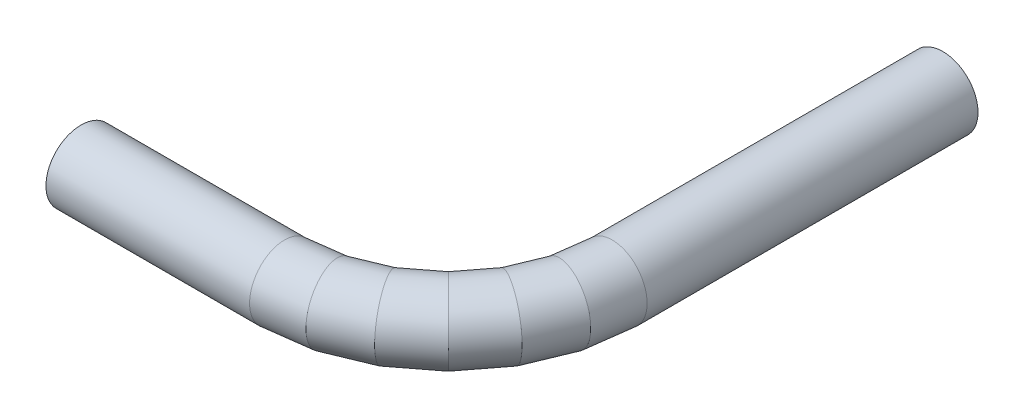
ISO-10303-21;
HEADER;
FILE_DESCRIPTION(('STEP AP214'),'2;1');
FILE_NAME('part.step','',(''),(''),'','','');
FILE_SCHEMA(('AUTOMOTIVE_DESIGN { 1 0 10303 214 1 1 1 1 }'));
ENDSEC;
DATA;
#1=APPLICATION_CONTEXT('core data for automotive mechanical design processes');
#2=APPLICATION_PROTOCOL_DEFINITION('international standard','automotive_design',2000,#1);
#3=PRODUCT_CONTEXT('',#1,'mechanical');
#4=PRODUCT('Part','Part','',(#3));
#5=PRODUCT_RELATED_PRODUCT_CATEGORY('part','',(#4));
#6=PRODUCT_DEFINITION_FORMATION('','',#4);
#7=PRODUCT_DEFINITION_CONTEXT('part definition',#1,'design');
#8=PRODUCT_DEFINITION('design','',#6,#7);
#9=PRODUCT_DEFINITION_SHAPE('','',#8);
#10=(LENGTH_UNIT() NAMED_UNIT(*) SI_UNIT(.MILLI.,.METRE.));
#11=(NAMED_UNIT(*) PLANE_ANGLE_UNIT() SI_UNIT($,.RADIAN.));
#12=(NAMED_UNIT(*) SI_UNIT($,.STERADIAN.) SOLID_ANGLE_UNIT());
#13=UNCERTAINTY_MEASURE_WITH_UNIT(LENGTH_MEASURE(1.E-05),#10,'distance_accuracy_value','');
#14=(GEOMETRIC_REPRESENTATION_CONTEXT(3) GLOBAL_UNCERTAINTY_ASSIGNED_CONTEXT((#13)) GLOBAL_UNIT_ASSIGNED_CONTEXT((#10,
#11,#12)) REPRESENTATION_CONTEXT('',''));
#15=CARTESIAN_POINT('',(0.,0.,0.));
#16=DIRECTION('',(0.,0.,1.));
#17=DIRECTION('',(1.,0.,0.));
#18=AXIS2_PLACEMENT_3D('',#15,#16,#17);
#19=CARTESIAN_POINT('',(-2911.59277838077,0.,55.3289105438819));
#20=DIRECTION('',(0.,0.,-1.));
#21=DIRECTION('',(0.,1.,0.));
#22=AXIS2_PLACEMENT_3D('',#19,#20,#21);
#23=CYLINDRICAL_SURFACE('',#22,3.175);
#24=CARTESIAN_POINT('',(-2911.59277838077,0.,55.0000000000001));
#25=DIRECTION('',(0.065403129230125,0.,-0.997858923238605));
#26=DIRECTION('',(0.997858923238605,0.,0.065403129230125));
#27=AXIS2_PLACEMENT_3D('',#24,#25,#26);
#28=ELLIPSE('',#27,3.18181250481317,3.175);
#29=CARTESIAN_POINT('',(-2908.41777838077,0.,55.2081004944384));
#30=VERTEX_POINT('',#29);
#31=EDGE_CURVE('E45',#30,#30,#28,.F.);
#32=ORIENTED_EDGE('',*,*,#31,.F.);
#33=EDGE_LOOP('',(#32));
#34=FACE_BOUND('',#33,.T.);
#35=CARTESIAN_POINT('',(-2911.59277838077,0.,25.2999999999997));
#36=DIRECTION('',(0.,0.,-1.));
#37=DIRECTION('',(-1.,0.,0.));
#38=AXIS2_PLACEMENT_3D('',#35,#36,#37);
#39=CIRCLE('',#38,3.175);
#40=CARTESIAN_POINT('',(-2914.76777838077,0.,25.2999999999997));
#41=VERTEX_POINT('',#40);
#42=EDGE_CURVE('E80',#41,#41,#39,.T.);
#43=ORIENTED_EDGE('',*,*,#42,.F.);
#44=EDGE_LOOP('',(#43));
#45=FACE_BOUND('',#44,.T.);
#46=ADVANCED_FACE('F39',(#34,#45),#23,.T.);
#47=CARTESIAN_POINT('',(-2912.17695907214,0.,59.4372928890041));
#48=DIRECTION('',(0.130526192220016,0.,-0.991444861373815));
#49=DIRECTION('',(-0.991444861373815,0.,-0.130526192220016));
#50=AXIS2_PLACEMENT_3D('',#47,#48,#49);
#51=CYLINDRICAL_SURFACE('',#50,3.175);
#52=CARTESIAN_POINT('',(-2912.10389098644,0.,58.8822856765378));
#53=DIRECTION('',(0.258819045102501,0.,-0.965925826289073));
#54=DIRECTION('',(0.965925826289074,0.,0.258819045102501));
#55=AXIS2_PLACEMENT_3D('',#52,#53,#54);
#56=ELLIPSE('',#55,3.20239694984199,3.175);
#57=CARTESIAN_POINT('',(-2909.01061306656,0.,59.7111269971351));
#58=VERTEX_POINT('',#57);
#59=EDGE_CURVE('E94',#58,#58,#56,.F.);
#60=ORIENTED_EDGE('',*,*,#59,.F.);
#61=EDGE_LOOP('',(#60));
#62=FACE_BOUND('',#61,.T.);
#63=ORIENTED_EDGE('',*,*,#31,.T.);
#64=EDGE_LOOP('',(#63));
#65=FACE_BOUND('',#64,.T.);
#66=ADVANCED_FACE('F101',(#62,#65),#51,.T.);
#67=CARTESIAN_POINT('',(-2913.81662211182,0.,63.0171843881291));
#68=DIRECTION('',(0.382683432365086,0.,-0.923879532511288));
#69=DIRECTION('',(-0.923879532511288,0.,-0.382683432365086));
#70=AXIS2_PLACEMENT_3D('',#67,#68,#69);
#71=CYLINDRICAL_SURFACE('',#70,3.175);
#72=CARTESIAN_POINT('',(-2913.60239732401,0.,62.4999999999998));
#73=DIRECTION('',(0.50000000000001,0.,-0.866025403784433));
#74=DIRECTION('',(0.866025403784433,0.,0.50000000000001));
#75=AXIS2_PLACEMENT_3D('',#72,#73,#74);
#76=ELLIPSE('',#75,3.20239694984199,3.175);
#77=CARTESIAN_POINT('',(-2910.82904021244,0.,64.1011984749208));
#78=VERTEX_POINT('',#77);
#79=EDGE_CURVE('E95',#78,#78,#76,.F.);
#80=ORIENTED_EDGE('',*,*,#79,.F.);
#81=EDGE_LOOP('',(#80));
#82=FACE_BOUND('',#81,.T.);
#83=ORIENTED_EDGE('',*,*,#59,.T.);
#84=EDGE_LOOP('',(#83));
#85=FACE_BOUND('',#84,.T.);
#86=ADVANCED_FACE('F251',(#82,#85),#71,.T.);
#87=CARTESIAN_POINT('',(-2916.32695908763,0.,66.0507180202266));
#88=DIRECTION('',(0.608761429008742,0.,-0.793353340291219));
#89=DIRECTION('',(-0.793353340291219,0.,-0.608761429008742));
#90=AXIS2_PLACEMENT_3D('',#87,#88,#89);
#91=CYLINDRICAL_SURFACE('',#90,3.175);
#92=CARTESIAN_POINT('',(-2915.98617666298,0.,65.6066017177984));
#93=DIRECTION('',(0.70710678118655,0.,-0.707106781186545));
#94=DIRECTION('',(0.707106781186545,0.,0.70710678118655));
#95=AXIS2_PLACEMENT_3D('',#92,#93,#94);
#96=ELLIPSE('',#95,3.20239694984197,3.175);
#97=CARTESIAN_POINT('',(-2913.72174006369,0.,67.8710383170828));
#98=VERTEX_POINT('',#97);
#99=EDGE_CURVE('E90',#98,#98,#96,.F.);
#100=ORIENTED_EDGE('',*,*,#99,.F.);
#101=EDGE_LOOP('',(#100));
#102=FACE_BOUND('',#101,.T.);
#103=ORIENTED_EDGE('',*,*,#79,.T.);
#104=EDGE_LOOP('',(#103));
#105=FACE_BOUND('',#104,.T.);
#106=ADVANCED_FACE('F241',(#102,#105),#91,.T.);
#107=CARTESIAN_POINT('',(-2919.5368946832,0.,68.3311634814221));
#108=DIRECTION('',(0.793353340291223,0.,-0.608761429008737));
#109=DIRECTION('',(-0.608761429008737,0.,-0.793353340291223));
#110=AXIS2_PLACEMENT_3D('',#107,#108,#109);
#111=CYLINDRICAL_SURFACE('',#110,3.175);
#112=CARTESIAN_POINT('',(-2919.09277838077,0.,67.9903810567668));
#113=DIRECTION('',(0.866025403784438,0.,-0.500000000000001));
#114=DIRECTION('',(0.500000000000001,0.,0.866025403784438));
#115=AXIS2_PLACEMENT_3D('',#112,#113,#114);
#116=ELLIPSE('',#115,3.20239694984199,3.175);
#117=CARTESIAN_POINT('',(-2917.49157990585,0.,70.7637381683317));
#118=VERTEX_POINT('',#117);
#119=EDGE_CURVE('E88',#118,#118,#116,.F.);
#120=ORIENTED_EDGE('',*,*,#119,.F.);
#121=EDGE_LOOP('',(#120));
#122=FACE_BOUND('',#121,.T.);
#123=ORIENTED_EDGE('',*,*,#99,.T.);
#124=EDGE_LOOP('',(#123));
#125=FACE_BOUND('',#124,.T.);
#126=ADVANCED_FACE('F233',(#122,#125),#111,.T.);
#127=CARTESIAN_POINT('',(-2923.22767709237,0.,69.703112182147));
#128=DIRECTION('',(0.923879532511294,0.,-0.382683432365073));
#129=DIRECTION('',(-0.382683432365073,0.,-0.923879532511294));
#130=AXIS2_PLACEMENT_3D('',#127,#128,#129);
#131=CYLINDRICAL_SURFACE('',#130,3.175);
#132=CARTESIAN_POINT('',(-2922.71049270424,0.,69.4888873943361));
#133=DIRECTION('',(0.965925826289071,0.,-0.258819045102512));
#134=DIRECTION('',(0.258819045102512,0.,0.965925826289071));
#135=AXIS2_PLACEMENT_3D('',#132,#133,#134);
#136=ELLIPSE('',#135,3.20239694984198,3.175);
#137=CARTESIAN_POINT('',(-2921.88165138364,0.,72.5821653142178));
#138=VERTEX_POINT('',#137);
#139=EDGE_CURVE('E85',#138,#138,#136,.F.);
#140=ORIENTED_EDGE('',*,*,#139,.F.);
#141=EDGE_LOOP('',(#140));
#142=FACE_BOUND('',#141,.T.);
#143=ORIENTED_EDGE('',*,*,#119,.T.);
#144=EDGE_LOOP('',(#143));
#145=FACE_BOUND('',#144,.T.);
#146=ADVANCED_FACE('F227',(#142,#145),#131,.T.);
#147=CARTESIAN_POINT('',(-2926.91887504936,0.,70.042931440874));
#148=DIRECTION('',(0.99144486137381,0.,-0.13052619222005));
#149=DIRECTION('',(-0.13052619222005,0.,-0.991444861373811));
#150=AXIS2_PLACEMENT_3D('',#147,#148,#149);
#151=CYLINDRICAL_SURFACE('',#150,3.175);
#152=CARTESIAN_POINT('',(-2926.59277838077,0.,70.));
#153=DIRECTION('',(0.997858923238604,0.,-0.0654031292301424));
#154=DIRECTION('',(0.0654031292301424,0.,0.997858923238604));
#155=AXIS2_PLACEMENT_3D('',#152,#153,#154);
#156=ELLIPSE('',#155,3.18181250481317,3.175);
#157=CARTESIAN_POINT('',(-2926.38467788634,0.,73.175));
#158=VERTEX_POINT('',#157);
#159=EDGE_CURVE('E78',#158,#158,#156,.F.);
#160=ORIENTED_EDGE('',*,*,#159,.F.);
#161=EDGE_LOOP('',(#160));
#162=FACE_BOUND('',#161,.T.);
#163=ORIENTED_EDGE('',*,*,#139,.T.);
#164=EDGE_LOOP('',(#163));
#165=FACE_BOUND('',#164,.T.);
#166=ADVANCED_FACE('F118',(#162,#165),#151,.T.);
#167=CARTESIAN_POINT('',(-2944.79277838077,0.,70.));
#168=DIRECTION('',(1.,0.,0.));
#169=DIRECTION('',(0.,0.,-1.));
#170=AXIS2_PLACEMENT_3D('',#167,#168,#169);
#171=CYLINDRICAL_SURFACE('',#170,3.175);
#172=CARTESIAN_POINT('',(-2944.79277838077,0.,70.));
#173=DIRECTION('',(1.,0.,0.));
#174=DIRECTION('',(0.,0.,-1.));
#175=AXIS2_PLACEMENT_3D('',#172,#173,#174);
#176=CIRCLE('',#175,3.175);
#177=CARTESIAN_POINT('',(-2944.79277838077,0.,66.825));
#178=VERTEX_POINT('',#177);
#179=EDGE_CURVE('E74',#178,#178,#176,.T.);
#180=ORIENTED_EDGE('',*,*,#179,.T.);
#181=EDGE_LOOP('',(#180));
#182=FACE_BOUND('',#181,.T.);
#183=ORIENTED_EDGE('',*,*,#159,.T.);
#184=EDGE_LOOP('',(#183));
#185=FACE_BOUND('',#184,.T.);
#186=ADVANCED_FACE('F109',(#182,#185),#171,.T.);
#187=CARTESIAN_POINT('',(-2911.59277838077,0.,25.2999999999997));
#188=DIRECTION('',(0.,0.,-1.));
#189=DIRECTION('',(-1.,0.,0.));
#190=AXIS2_PLACEMENT_3D('',#187,#188,#189);
#191=PLANE('',#190);
#192=CARTESIAN_POINT('',(-2911.59277838077,0.,25.2999999999997));
#193=DIRECTION('',(0.,0.,-1.));
#194=DIRECTION('',(-1.,0.,0.));
#195=AXIS2_PLACEMENT_3D('',#192,#193,#194);
#196=CIRCLE('',#195,2.286);
#197=CARTESIAN_POINT('',(-2913.87877838077,0.,25.2999999999997));
#198=VERTEX_POINT('',#197);
#199=EDGE_CURVE('E72',#198,#198,#196,.F.);
#200=ORIENTED_EDGE('',*,*,#199,.T.);
#201=EDGE_LOOP('',(#200));
#202=FACE_BOUND('',#201,.T.);
#203=ORIENTED_EDGE('',*,*,#42,.T.);
#204=EDGE_LOOP('',(#203));
#205=FACE_BOUND('',#204,.T.);
#206=ADVANCED_FACE('F110',(#202,#205),#191,.T.);
#207=CARTESIAN_POINT('',(-2944.79277838077,0.,70.));
#208=DIRECTION('',(1.,0.,0.));
#209=DIRECTION('',(0.,0.,-1.));
#210=AXIS2_PLACEMENT_3D('',#207,#208,#209);
#211=PLANE('',#210);
#212=CARTESIAN_POINT('',(-2944.79277838077,0.,70.));
#213=DIRECTION('',(1.,0.,0.));
#214=DIRECTION('',(0.,0.,-1.));
#215=AXIS2_PLACEMENT_3D('',#212,#213,#214);
#216=CIRCLE('',#215,2.286);
#217=CARTESIAN_POINT('',(-2944.79277838077,0.,67.714));
#218=VERTEX_POINT('',#217);
#219=EDGE_CURVE('E46',#218,#218,#216,.F.);
#220=ORIENTED_EDGE('',*,*,#219,.F.);
#221=EDGE_LOOP('',(#220));
#222=FACE_BOUND('',#221,.T.);
#223=ORIENTED_EDGE('',*,*,#179,.F.);
#224=EDGE_LOOP('',(#223));
#225=FACE_BOUND('',#224,.T.);
#226=ADVANCED_FACE('F108',(#222,#225),#211,.F.);
#227=CARTESIAN_POINT('',(-2911.59277838077,0.,55.2648155915949));
#228=DIRECTION('',(0.,0.,-1.));
#229=DIRECTION('',(0.,1.,0.));
#230=AXIS2_PLACEMENT_3D('',#227,#228,#229);
#231=CYLINDRICAL_SURFACE('',#230,2.286);
#232=CARTESIAN_POINT('',(-2911.59277838077,0.,55.));
#233=DIRECTION('',(0.065403129230125,0.,-0.997858923238605));
#234=DIRECTION('',(0.997858923238605,0.,0.065403129230125));
#235=AXIS2_PLACEMENT_3D('',#232,#233,#234);
#236=ELLIPSE('',#235,2.29090500346548,2.286);
#237=CARTESIAN_POINT('',(-2909.30677838077,0.,55.1498323559956));
#238=VERTEX_POINT('',#237);
#239=EDGE_CURVE('E70',#238,#238,#236,.T.);
#240=ORIENTED_EDGE('',*,*,#239,.F.);
#241=EDGE_LOOP('',(#240));
#242=FACE_BOUND('',#241,.T.);
#243=ORIENTED_EDGE('',*,*,#199,.F.);
#244=EDGE_LOOP('',(#243));
#245=FACE_BOUND('',#244,.T.);
#246=ADVANCED_FACE('F120',(#242,#245),#231,.F.);
#247=CARTESIAN_POINT('',(-2912.16015474152,0.,59.3096513256319));
#248=DIRECTION('',(0.130526192220016,0.,-0.991444861373815));
#249=DIRECTION('',(-0.991444861373815,0.,-0.130526192220016));
#250=AXIS2_PLACEMENT_3D('',#247,#248,#249);
#251=CYLINDRICAL_SURFACE('',#250,2.286);
#252=CARTESIAN_POINT('',(-2912.10389098644,0.,58.8822856765379));
#253=DIRECTION('',(0.258819045102501,0.,-0.965925826289074));
#254=DIRECTION('',(0.965925826289074,0.,0.258819045102501));
#255=AXIS2_PLACEMENT_3D('',#252,#253,#254);
#256=ELLIPSE('',#255,2.30572580388623,2.286);
#257=CARTESIAN_POINT('',(-2909.87673088412,0.,59.479051427368));
#258=VERTEX_POINT('',#257);
#259=EDGE_CURVE('E63',#258,#258,#256,.T.);
#260=ORIENTED_EDGE('',*,*,#259,.F.);
#261=EDGE_LOOP('',(#260));
#262=FACE_BOUND('',#261,.T.);
#263=ORIENTED_EDGE('',*,*,#239,.T.);
#264=EDGE_LOOP('',(#263));
#265=FACE_BOUND('',#264,.T.);
#266=ADVANCED_FACE('F149',(#262,#265),#251,.F.);
#267=CARTESIAN_POINT('',(-2913.76735430734,0.,62.898241386363));
#268=DIRECTION('',(0.382683432365086,0.,-0.923879532511288));
#269=DIRECTION('',(-0.923879532511288,0.,-0.382683432365086));
#270=AXIS2_PLACEMENT_3D('',#267,#268,#269);
#271=CYLINDRICAL_SURFACE('',#270,2.286);
#272=CARTESIAN_POINT('',(-2913.60239732401,0.,62.4999999999996));
#273=DIRECTION('',(0.50000000000001,0.,-0.866025403784433));
#274=DIRECTION('',(0.866025403784433,0.,0.50000000000001));
#275=AXIS2_PLACEMENT_3D('',#272,#273,#274);
#276=ELLIPSE('',#275,2.30572580388623,2.286);
#277=CARTESIAN_POINT('',(-2911.60558020368,0.,63.6528629019427));
#278=VERTEX_POINT('',#277);
#279=EDGE_CURVE('E65',#278,#278,#276,.T.);
#280=ORIENTED_EDGE('',*,*,#279,.F.);
#281=EDGE_LOOP('',(#280));
#282=FACE_BOUND('',#281,.T.);
#283=ORIENTED_EDGE('',*,*,#259,.T.);
#284=EDGE_LOOP('',(#283));
#285=FACE_BOUND('',#284,.T.);
#286=ADVANCED_FACE('F144',(#282,#285),#271,.F.);
#287=CARTESIAN_POINT('',(-2916.24858532874,0.,65.9485793490746));
#288=DIRECTION('',(0.608761429008742,0.,-0.793353340291219));
#289=DIRECTION('',(-0.793353340291219,0.,-0.608761429008742));
#290=AXIS2_PLACEMENT_3D('',#287,#288,#289);
#291=CYLINDRICAL_SURFACE('',#290,2.286);
#292=CARTESIAN_POINT('',(-2915.98617666298,0.,65.6066017177984));
#293=DIRECTION('',(0.707106781186549,0.,-0.707106781186546));
#294=DIRECTION('',(0.707106781186546,0.,0.707106781186549));
#295=AXIS2_PLACEMENT_3D('',#292,#293,#294);
#296=ELLIPSE('',#295,2.30572580388622,2.286);
#297=CARTESIAN_POINT('',(-2914.35578231149,0.,67.2369960692832));
#298=VERTEX_POINT('',#297);
#299=EDGE_CURVE('E56',#298,#298,#296,.T.);
#300=ORIENTED_EDGE('',*,*,#299,.F.);
#301=EDGE_LOOP('',(#300));
#302=FACE_BOUND('',#301,.T.);
#303=ORIENTED_EDGE('',*,*,#279,.T.);
#304=EDGE_LOOP('',(#303));
#305=FACE_BOUND('',#304,.T.);
#306=ADVANCED_FACE('F143',(#302,#305),#291,.F.);
#307=CARTESIAN_POINT('',(-2919.43475601205,0.,68.2527897225309));
#308=DIRECTION('',(0.793353340291223,0.,-0.608761429008737));
#309=DIRECTION('',(-0.608761429008737,0.,-0.793353340291223));
#310=AXIS2_PLACEMENT_3D('',#307,#308,#309);
#311=CYLINDRICAL_SURFACE('',#310,2.286);
#312=CARTESIAN_POINT('',(-2919.09277838077,0.,67.9903810567667));
#313=DIRECTION('',(0.866025403784438,0.,-0.500000000000001));
#314=DIRECTION('',(0.500000000000001,0.,0.866025403784438));
#315=AXIS2_PLACEMENT_3D('',#312,#313,#314);
#316=ELLIPSE('',#315,2.30572580388623,2.286);
#317=CARTESIAN_POINT('',(-2917.93991547883,0.,69.9871981770935));
#318=VERTEX_POINT('',#317);
#319=EDGE_CURVE('E57',#318,#318,#316,.T.);
#320=ORIENTED_EDGE('',*,*,#319,.F.);
#321=EDGE_LOOP('',(#320));
#322=FACE_BOUND('',#321,.T.);
#323=ORIENTED_EDGE('',*,*,#299,.T.);
#324=EDGE_LOOP('',(#323));
#325=FACE_BOUND('',#324,.T.);
#326=ADVANCED_FACE('F139',(#322,#325),#311,.F.);
#327=CARTESIAN_POINT('',(-2923.1087340906,0.,69.6538443776662));
#328=DIRECTION('',(0.923879532511293,0.,-0.382683432365073));
#329=DIRECTION('',(-0.382683432365073,0.,-0.923879532511294));
#330=AXIS2_PLACEMENT_3D('',#327,#328,#329);
#331=CYLINDRICAL_SURFACE('',#330,2.286);
#332=CARTESIAN_POINT('',(-2922.71049270424,0.,69.4888873943361));
#333=DIRECTION('',(0.965925826289071,0.,-0.258819045102512));
#334=DIRECTION('',(0.258819045102512,0.,0.965925826289071));
#335=AXIS2_PLACEMENT_3D('',#332,#333,#334);
#336=ELLIPSE('',#335,2.30572580388622,2.286);
#337=CARTESIAN_POINT('',(-2922.11372695341,0.,71.7160474966509));
#338=VERTEX_POINT('',#337);
#339=EDGE_CURVE('E51',#338,#338,#336,.T.);
#340=ORIENTED_EDGE('',*,*,#339,.F.);
#341=EDGE_LOOP('',(#340));
#342=FACE_BOUND('',#341,.T.);
#343=ORIENTED_EDGE('',*,*,#319,.T.);
#344=EDGE_LOOP('',(#343));
#345=FACE_BOUND('',#344,.T.);
#346=ADVANCED_FACE('F132',(#342,#345),#331,.F.);
#347=CARTESIAN_POINT('',(-2926.85532843827,0.,70.0345653708114));
#348=DIRECTION('',(0.991444861373811,0.,-0.13052619222005));
#349=DIRECTION('',(-0.13052619222005,0.,-0.991444861373811));
#350=AXIS2_PLACEMENT_3D('',#347,#348,#349);
#351=CYLINDRICAL_SURFACE('',#350,2.286);
#352=CARTESIAN_POINT('',(-2926.59277838077,0.,70.));
#353=DIRECTION('',(0.997858923238603,0.,-0.0654031292301424));
#354=DIRECTION('',(0.0654031292301425,0.,0.997858923238604));
#355=AXIS2_PLACEMENT_3D('',#352,#353,#354);
#356=ELLIPSE('',#355,2.29090500346548,2.286);
#357=CARTESIAN_POINT('',(-2926.44294602478,0.,72.286));
#358=VERTEX_POINT('',#357);
#359=EDGE_CURVE('E10',#358,#358,#356,.T.);
#360=ORIENTED_EDGE('',*,*,#359,.F.);
#361=EDGE_LOOP('',(#360));
#362=FACE_BOUND('',#361,.T.);
#363=ORIENTED_EDGE('',*,*,#339,.T.);
#364=EDGE_LOOP('',(#363));
#365=FACE_BOUND('',#364,.T.);
#366=ADVANCED_FACE('F123',(#362,#365),#351,.F.);
#367=CARTESIAN_POINT('',(-2944.79277838077,0.,70.));
#368=DIRECTION('',(1.,0.,0.));
#369=DIRECTION('',(0.,0.,-1.));
#370=AXIS2_PLACEMENT_3D('',#367,#368,#369);
#371=CYLINDRICAL_SURFACE('',#370,2.286);
#372=ORIENTED_EDGE('',*,*,#219,.T.);
#373=EDGE_LOOP('',(#372));
#374=FACE_BOUND('',#373,.T.);
#375=ORIENTED_EDGE('',*,*,#359,.T.);
#376=EDGE_LOOP('',(#375));
#377=FACE_BOUND('',#376,.T.);
#378=ADVANCED_FACE('F125',(#374,#377),#371,.F.);
#379=CLOSED_SHELL('',(#46,#66,#86,#106,#126,#146,#166,#186,#206,#226,#246,#266,#286,#306,#326,
#346,#366,#378));
#380=MANIFOLD_SOLID_BREP('B2',#379);
#381=ADVANCED_BREP_SHAPE_REPRESENTATION('',(#18,#380),#14);
#382=SHAPE_DEFINITION_REPRESENTATION(#9,#381);
ENDSEC;
END-ISO-10303-21;
